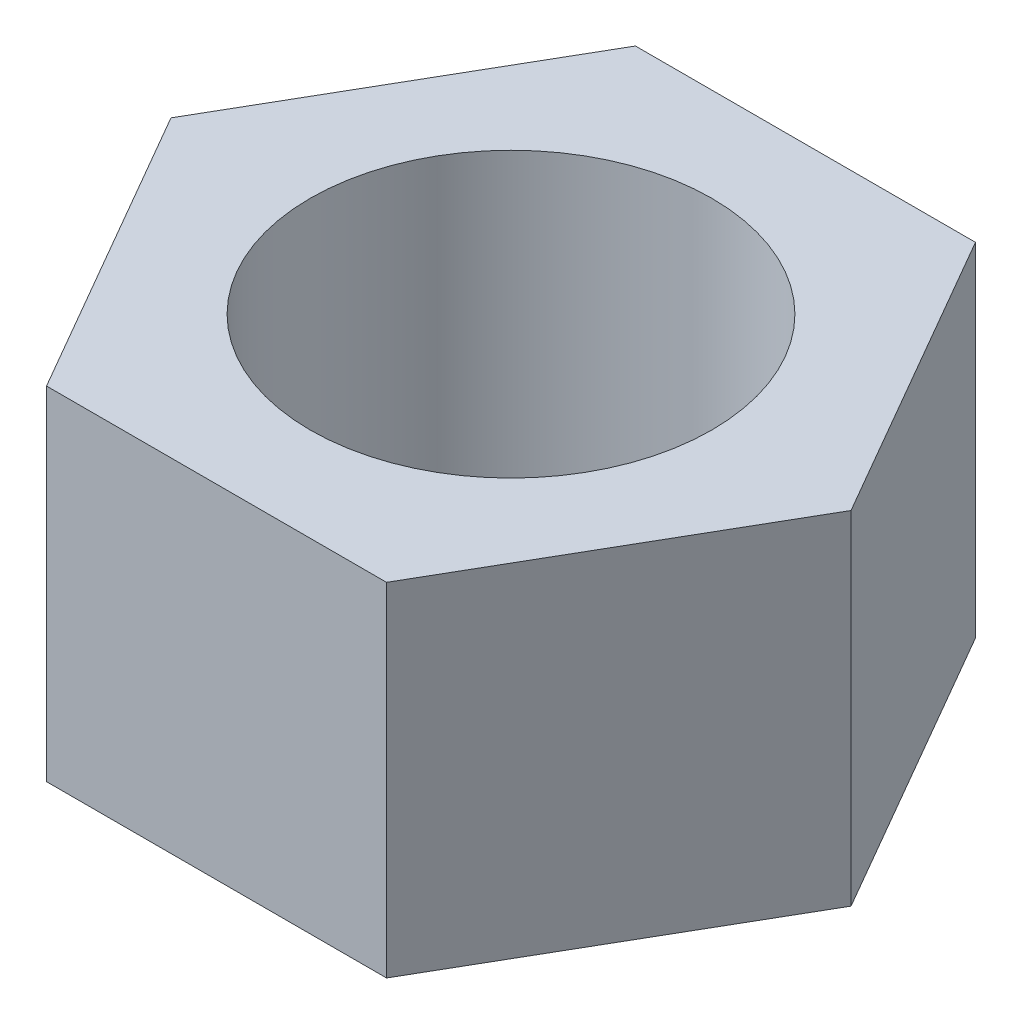
ISO-10303-21;
HEADER;
FILE_DESCRIPTION(('STEP AP214'),'2;1');
FILE_NAME('part.step','',(''),(''),'','','');
FILE_SCHEMA(('AUTOMOTIVE_DESIGN { 1 0 10303 214 1 1 1 1 }'));
ENDSEC;
DATA;
#1=APPLICATION_CONTEXT('core data for automotive mechanical design processes');
#2=APPLICATION_PROTOCOL_DEFINITION('international standard','automotive_design',2000,#1);
#3=PRODUCT_CONTEXT('',#1,'mechanical');
#4=PRODUCT('Part','Part','',(#3));
#5=PRODUCT_RELATED_PRODUCT_CATEGORY('part','',(#4));
#6=PRODUCT_DEFINITION_FORMATION('','',#4);
#7=PRODUCT_DEFINITION_CONTEXT('part definition',#1,'design');
#8=PRODUCT_DEFINITION('design','',#6,#7);
#9=PRODUCT_DEFINITION_SHAPE('','',#8);
#10=(LENGTH_UNIT() NAMED_UNIT(*) SI_UNIT(.MILLI.,.METRE.));
#11=(NAMED_UNIT(*) PLANE_ANGLE_UNIT() SI_UNIT($,.RADIAN.));
#12=(NAMED_UNIT(*) SI_UNIT($,.STERADIAN.) SOLID_ANGLE_UNIT());
#13=UNCERTAINTY_MEASURE_WITH_UNIT(LENGTH_MEASURE(1.E-05),#10,'distance_accuracy_value','');
#14=(GEOMETRIC_REPRESENTATION_CONTEXT(3) GLOBAL_UNCERTAINTY_ASSIGNED_CONTEXT((#13)) GLOBAL_UNIT_ASSIGNED_CONTEXT((#10,
#11,#12)) REPRESENTATION_CONTEXT('',''));
#15=CARTESIAN_POINT('',(0.,0.,0.));
#16=DIRECTION('',(0.,0.,1.));
#17=DIRECTION('',(1.,0.,0.));
#18=AXIS2_PLACEMENT_3D('',#15,#16,#17);
#19=CARTESIAN_POINT('',(0.,16.256,0.));
#20=DIRECTION('',(0.,1.,0.));
#21=DIRECTION('',(0.,0.,1.));
#22=AXIS2_PLACEMENT_3D('',#19,#20,#21);
#23=PLANE('',#22);
#24=DIRECTION('',(-0.5,0.,-0.866025403784439));
#25=VECTOR('',#24,1.);
#26=CARTESIAN_POINT('',(16.1311665211582,16.256,0.));
#27=LINE('',#26,#25);
#28=CARTESIAN_POINT('',(16.1311665211582,16.256,0.));
#29=VERTEX_POINT('',#28);
#30=CARTESIAN_POINT('',(8.06558326057907,16.256,-13.97));
#31=VERTEX_POINT('',#30);
#32=EDGE_CURVE('E152',#29,#31,#27,.T.);
#33=ORIENTED_EDGE('',*,*,#32,.T.);
#34=DIRECTION('',(-1.,0.,0.));
#35=VECTOR('',#34,1.);
#36=CARTESIAN_POINT('',(8.06558326057907,16.256,-13.97));
#37=LINE('',#36,#35);
#38=CARTESIAN_POINT('',(-8.06558326057908,16.256,-13.97));
#39=VERTEX_POINT('',#38);
#40=EDGE_CURVE('E100',#31,#39,#37,.T.);
#41=ORIENTED_EDGE('',*,*,#40,.T.);
#42=DIRECTION('',(-0.5,0.,0.866025403784439));
#43=VECTOR('',#42,1.);
#44=CARTESIAN_POINT('',(-8.06558326057908,16.256,-13.97));
#45=LINE('',#44,#43);
#46=CARTESIAN_POINT('',(-16.1311665211582,16.256,0.));
#47=VERTEX_POINT('',#46);
#48=EDGE_CURVE('E113',#39,#47,#45,.T.);
#49=ORIENTED_EDGE('',*,*,#48,.T.);
#50=DIRECTION('',(0.5,0.,0.866025403784439));
#51=VECTOR('',#50,1.);
#52=CARTESIAN_POINT('',(-16.1311665211582,16.256,0.));
#53=LINE('',#52,#51);
#54=CARTESIAN_POINT('',(-8.06558326057908,16.256,13.97));
#55=VERTEX_POINT('',#54);
#56=EDGE_CURVE('E107',#47,#55,#53,.T.);
#57=ORIENTED_EDGE('',*,*,#56,.T.);
#58=DIRECTION('',(1.,0.,0.));
#59=VECTOR('',#58,1.);
#60=CARTESIAN_POINT('',(-8.06558326057908,16.256,13.97));
#61=LINE('',#60,#59);
#62=CARTESIAN_POINT('',(8.06558326057908,16.256,13.97));
#63=VERTEX_POINT('',#62);
#64=EDGE_CURVE('E111',#55,#63,#61,.T.);
#65=ORIENTED_EDGE('',*,*,#64,.T.);
#66=DIRECTION('',(0.5,0.,-0.866025403784439));
#67=VECTOR('',#66,1.);
#68=CARTESIAN_POINT('',(8.06558326057908,16.256,13.97));
#69=LINE('',#68,#67);
#70=EDGE_CURVE('E63',#63,#29,#69,.T.);
#71=ORIENTED_EDGE('',*,*,#70,.T.);
#72=EDGE_LOOP('',(#33,#41,#49,#57,#65,#71));
#73=FACE_BOUND('',#72,.T.);
#74=CARTESIAN_POINT('',(0.,16.256,0.));
#75=DIRECTION('',(0.,1.,0.));
#76=DIRECTION('',(0.,0.,1.));
#77=AXIS2_PLACEMENT_3D('',#74,#75,#76);
#78=CIRCLE('',#77,9.525);
#79=CARTESIAN_POINT('',(0.,16.256,9.525));
#80=VERTEX_POINT('',#79);
#81=EDGE_CURVE('E140',#80,#80,#78,.T.);
#82=ORIENTED_EDGE('',*,*,#81,.F.);
#83=EDGE_LOOP('',(#82));
#84=FACE_BOUND('',#83,.T.);
#85=ADVANCED_FACE('F45',(#73,#84),#23,.T.);
#86=CARTESIAN_POINT('',(0.,0.,0.));
#87=DIRECTION('',(0.,1.,0.));
#88=DIRECTION('',(0.,0.,1.));
#89=AXIS2_PLACEMENT_3D('',#86,#87,#88);
#90=PLANE('',#89);
#91=DIRECTION('',(-0.5,0.,-0.866025403784439));
#92=VECTOR('',#91,1.);
#93=CARTESIAN_POINT('',(16.1311665211582,0.,0.));
#94=LINE('',#93,#92);
#95=CARTESIAN_POINT('',(16.1311665211582,0.,0.));
#96=VERTEX_POINT('',#95);
#97=CARTESIAN_POINT('',(8.06558326057907,0.,-13.97));
#98=VERTEX_POINT('',#97);
#99=EDGE_CURVE('E135',#96,#98,#94,.T.);
#100=ORIENTED_EDGE('',*,*,#99,.F.);
#101=DIRECTION('',(0.5,0.,-0.866025403784439));
#102=VECTOR('',#101,1.);
#103=CARTESIAN_POINT('',(8.06558326057908,0.,13.97));
#104=LINE('',#103,#102);
#105=CARTESIAN_POINT('',(8.06558326057908,0.,13.97));
#106=VERTEX_POINT('',#105);
#107=EDGE_CURVE('E92',#106,#96,#104,.T.);
#108=ORIENTED_EDGE('',*,*,#107,.F.);
#109=DIRECTION('',(1.,0.,0.));
#110=VECTOR('',#109,1.);
#111=CARTESIAN_POINT('',(-8.06558326057908,0.,13.97));
#112=LINE('',#111,#110);
#113=CARTESIAN_POINT('',(-8.06558326057908,0.,13.97));
#114=VERTEX_POINT('',#113);
#115=EDGE_CURVE('E86',#114,#106,#112,.T.);
#116=ORIENTED_EDGE('',*,*,#115,.F.);
#117=DIRECTION('',(0.5,0.,0.866025403784439));
#118=VECTOR('',#117,1.);
#119=CARTESIAN_POINT('',(-16.1311665211582,0.,0.));
#120=LINE('',#119,#118);
#121=CARTESIAN_POINT('',(-16.1311665211582,0.,0.));
#122=VERTEX_POINT('',#121);
#123=EDGE_CURVE('E122',#122,#114,#120,.T.);
#124=ORIENTED_EDGE('',*,*,#123,.F.);
#125=DIRECTION('',(-0.5,0.,0.866025403784439));
#126=VECTOR('',#125,1.);
#127=CARTESIAN_POINT('',(-8.06558326057908,0.,-13.97));
#128=LINE('',#127,#126);
#129=CARTESIAN_POINT('',(-8.06558326057908,0.,-13.97));
#130=VERTEX_POINT('',#129);
#131=EDGE_CURVE('E143',#130,#122,#128,.T.);
#132=ORIENTED_EDGE('',*,*,#131,.F.);
#133=DIRECTION('',(-1.,0.,0.));
#134=VECTOR('',#133,1.);
#135=CARTESIAN_POINT('',(8.06558326057907,0.,-13.97));
#136=LINE('',#135,#134);
#137=EDGE_CURVE('E139',#98,#130,#136,.T.);
#138=ORIENTED_EDGE('',*,*,#137,.F.);
#139=EDGE_LOOP('',(#100,#108,#116,#124,#132,#138));
#140=FACE_BOUND('',#139,.T.);
#141=CARTESIAN_POINT('',(0.,0.,0.));
#142=DIRECTION('',(0.,1.,0.));
#143=DIRECTION('',(0.,0.,1.));
#144=AXIS2_PLACEMENT_3D('',#141,#142,#143);
#145=CIRCLE('',#144,9.525);
#146=CARTESIAN_POINT('',(0.,0.,9.525));
#147=VERTEX_POINT('',#146);
#148=EDGE_CURVE('E249',#147,#147,#145,.T.);
#149=ORIENTED_EDGE('',*,*,#148,.T.);
#150=EDGE_LOOP('',(#149));
#151=FACE_BOUND('',#150,.T.);
#152=ADVANCED_FACE('F165',(#140,#151),#90,.F.);
#153=CARTESIAN_POINT('',(16.1311665211582,16.256,0.));
#154=DIRECTION('',(-0.866025403784439,0.,0.5));
#155=DIRECTION('',(0.5,0.,0.866025403784439));
#156=AXIS2_PLACEMENT_3D('',#153,#154,#155);
#157=PLANE('',#156);
#158=ORIENTED_EDGE('',*,*,#99,.T.);
#159=DIRECTION('',(0.,-1.,0.));
#160=VECTOR('',#159,1.);
#161=CARTESIAN_POINT('',(8.06558326057907,16.256,-13.97));
#162=LINE('',#161,#160);
#163=EDGE_CURVE('E11',#31,#98,#162,.T.);
#164=ORIENTED_EDGE('',*,*,#163,.F.);
#165=ORIENTED_EDGE('',*,*,#32,.F.);
#166=DIRECTION('',(0.,-1.,0.));
#167=VECTOR('',#166,1.);
#168=CARTESIAN_POINT('',(16.1311665211582,16.256,0.));
#169=LINE('',#168,#167);
#170=EDGE_CURVE('E131',#29,#96,#169,.T.);
#171=ORIENTED_EDGE('',*,*,#170,.T.);
#172=EDGE_LOOP('',(#158,#164,#165,#171));
#173=FACE_BOUND('',#172,.T.);
#174=ADVANCED_FACE('F47',(#173),#157,.F.);
#175=CARTESIAN_POINT('',(8.06558326057907,16.256,-13.97));
#176=DIRECTION('',(0.,0.,1.));
#177=DIRECTION('',(1.,0.,0.));
#178=AXIS2_PLACEMENT_3D('',#175,#176,#177);
#179=PLANE('',#178);
#180=ORIENTED_EDGE('',*,*,#137,.T.);
#181=DIRECTION('',(0.,-1.,0.));
#182=VECTOR('',#181,1.);
#183=CARTESIAN_POINT('',(-8.06558326057908,16.256,-13.97));
#184=LINE('',#183,#182);
#185=EDGE_CURVE('E55',#39,#130,#184,.T.);
#186=ORIENTED_EDGE('',*,*,#185,.F.);
#187=ORIENTED_EDGE('',*,*,#40,.F.);
#188=ORIENTED_EDGE('',*,*,#163,.T.);
#189=EDGE_LOOP('',(#180,#186,#187,#188));
#190=FACE_BOUND('',#189,.T.);
#191=ADVANCED_FACE('F190',(#190),#179,.F.);
#192=CARTESIAN_POINT('',(-8.06558326057908,16.256,-13.97));
#193=DIRECTION('',(0.866025403784439,0.,0.5));
#194=DIRECTION('',(0.5,0.,-0.866025403784439));
#195=AXIS2_PLACEMENT_3D('',#192,#193,#194);
#196=PLANE('',#195);
#197=ORIENTED_EDGE('',*,*,#131,.T.);
#198=DIRECTION('',(0.,-1.,0.));
#199=VECTOR('',#198,1.);
#200=CARTESIAN_POINT('',(-16.1311665211582,16.256,0.));
#201=LINE('',#200,#199);
#202=EDGE_CURVE('E124',#47,#122,#201,.T.);
#203=ORIENTED_EDGE('',*,*,#202,.F.);
#204=ORIENTED_EDGE('',*,*,#48,.F.);
#205=ORIENTED_EDGE('',*,*,#185,.T.);
#206=EDGE_LOOP('',(#197,#203,#204,#205));
#207=FACE_BOUND('',#206,.T.);
#208=ADVANCED_FACE('F162',(#207),#196,.F.);
#209=CARTESIAN_POINT('',(-16.1311665211582,16.256,0.));
#210=DIRECTION('',(0.866025403784439,0.,-0.5));
#211=DIRECTION('',(-0.5,0.,-0.866025403784439));
#212=AXIS2_PLACEMENT_3D('',#209,#210,#211);
#213=PLANE('',#212);
#214=ORIENTED_EDGE('',*,*,#123,.T.);
#215=DIRECTION('',(0.,-1.,0.));
#216=VECTOR('',#215,1.);
#217=CARTESIAN_POINT('',(-8.06558326057908,16.256,13.97));
#218=LINE('',#217,#216);
#219=EDGE_CURVE('E119',#55,#114,#218,.T.);
#220=ORIENTED_EDGE('',*,*,#219,.F.);
#221=ORIENTED_EDGE('',*,*,#56,.F.);
#222=ORIENTED_EDGE('',*,*,#202,.T.);
#223=EDGE_LOOP('',(#214,#220,#221,#222));
#224=FACE_BOUND('',#223,.T.);
#225=ADVANCED_FACE('F120',(#224),#213,.F.);
#226=CARTESIAN_POINT('',(-8.06558326057908,16.256,13.97));
#227=DIRECTION('',(0.,0.,-1.));
#228=DIRECTION('',(-1.,0.,0.));
#229=AXIS2_PLACEMENT_3D('',#226,#227,#228);
#230=PLANE('',#229);
#231=ORIENTED_EDGE('',*,*,#115,.T.);
#232=DIRECTION('',(0.,-1.,0.));
#233=VECTOR('',#232,1.);
#234=CARTESIAN_POINT('',(8.06558326057908,16.256,13.97));
#235=LINE('',#234,#233);
#236=EDGE_CURVE('E125',#63,#106,#235,.T.);
#237=ORIENTED_EDGE('',*,*,#236,.F.);
#238=ORIENTED_EDGE('',*,*,#64,.F.);
#239=ORIENTED_EDGE('',*,*,#219,.T.);
#240=EDGE_LOOP('',(#231,#237,#238,#239));
#241=FACE_BOUND('',#240,.T.);
#242=ADVANCED_FACE('F127',(#241),#230,.F.);
#243=CARTESIAN_POINT('',(8.06558326057908,16.256,13.97));
#244=DIRECTION('',(-0.866025403784439,0.,-0.5));
#245=DIRECTION('',(-0.5,0.,0.866025403784439));
#246=AXIS2_PLACEMENT_3D('',#243,#244,#245);
#247=PLANE('',#246);
#248=ORIENTED_EDGE('',*,*,#107,.T.);
#249=ORIENTED_EDGE('',*,*,#170,.F.);
#250=ORIENTED_EDGE('',*,*,#70,.F.);
#251=ORIENTED_EDGE('',*,*,#236,.T.);
#252=EDGE_LOOP('',(#248,#249,#250,#251));
#253=FACE_BOUND('',#252,.T.);
#254=ADVANCED_FACE('F170',(#253),#247,.F.);
#255=CARTESIAN_POINT('',(0.,16.256,0.));
#256=DIRECTION('',(0.,-1.,0.));
#257=DIRECTION('',(0.,0.,-1.));
#258=AXIS2_PLACEMENT_3D('',#255,#256,#257);
#259=CYLINDRICAL_SURFACE('',#258,9.525);
#260=ORIENTED_EDGE('',*,*,#81,.T.);
#261=EDGE_LOOP('',(#260));
#262=FACE_BOUND('',#261,.T.);
#263=ORIENTED_EDGE('',*,*,#148,.F.);
#264=EDGE_LOOP('',(#263));
#265=FACE_BOUND('',#264,.T.);
#266=ADVANCED_FACE('F172',(#262,#265),#259,.F.);
#267=CLOSED_SHELL('',(#85,#152,#174,#191,#208,#225,#242,#254,#266));
#268=MANIFOLD_SOLID_BREP('B2',#267);
#269=ADVANCED_BREP_SHAPE_REPRESENTATION('',(#18,#268),#14);
#270=SHAPE_DEFINITION_REPRESENTATION(#9,#269);
ENDSEC;
END-ISO-10303-21;
